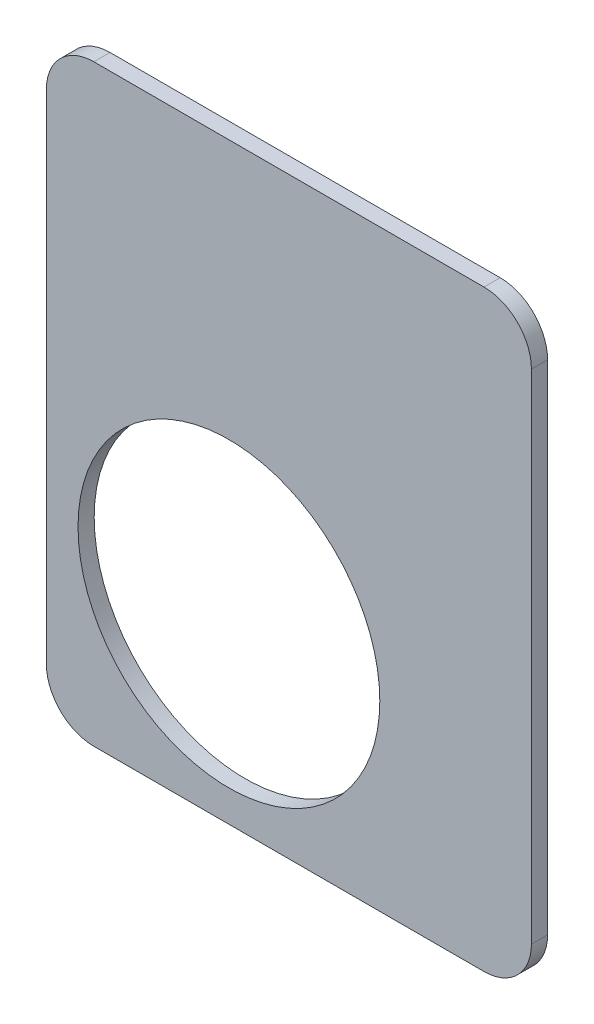
ISO-10303-21;
HEADER;
FILE_DESCRIPTION(('STEP AP214'),'2;1');
FILE_NAME('part.step','',(''),(''),'','','');
FILE_SCHEMA(('AUTOMOTIVE_DESIGN { 1 0 10303 214 1 1 1 1 }'));
ENDSEC;
DATA;
#1=APPLICATION_CONTEXT('core data for automotive mechanical design processes');
#2=APPLICATION_PROTOCOL_DEFINITION('international standard','automotive_design',2000,#1);
#3=PRODUCT_CONTEXT('',#1,'mechanical');
#4=PRODUCT('Part','Part','',(#3));
#5=PRODUCT_RELATED_PRODUCT_CATEGORY('part','',(#4));
#6=PRODUCT_DEFINITION_FORMATION('','',#4);
#7=PRODUCT_DEFINITION_CONTEXT('part definition',#1,'design');
#8=PRODUCT_DEFINITION('design','',#6,#7);
#9=PRODUCT_DEFINITION_SHAPE('','',#8);
#10=(LENGTH_UNIT() NAMED_UNIT(*) SI_UNIT(.MILLI.,.METRE.));
#11=(NAMED_UNIT(*) PLANE_ANGLE_UNIT() SI_UNIT($,.RADIAN.));
#12=(NAMED_UNIT(*) SI_UNIT($,.STERADIAN.) SOLID_ANGLE_UNIT());
#13=UNCERTAINTY_MEASURE_WITH_UNIT(LENGTH_MEASURE(1.E-05),#10,'distance_accuracy_value','');
#14=(GEOMETRIC_REPRESENTATION_CONTEXT(3) GLOBAL_UNCERTAINTY_ASSIGNED_CONTEXT((#13)) GLOBAL_UNIT_ASSIGNED_CONTEXT((#10,
#11,#12)) REPRESENTATION_CONTEXT('',''));
#15=CARTESIAN_POINT('',(0.,0.,0.));
#16=DIRECTION('',(0.,0.,1.));
#17=DIRECTION('',(1.,0.,0.));
#18=AXIS2_PLACEMENT_3D('',#15,#16,#17);
#19=CARTESIAN_POINT('',(293.583334894801,67.8218453448978,15.));
#20=DIRECTION('',(1.,0.,0.));
#21=DIRECTION('',(0.,1.,0.));
#22=AXIS2_PLACEMENT_3D('',#19,#20,#21);
#23=PLANE('',#22);
#24=DIRECTION('',(0.,-1.,0.));
#25=VECTOR('',#24,1.);
#26=CARTESIAN_POINT('',(293.583334894801,67.8218453448978,0.));
#27=LINE('',#26,#25);
#28=CARTESIAN_POINT('',(293.583334894801,67.8218453448978,0.));
#29=VERTEX_POINT('',#28);
#30=CARTESIAN_POINT('',(293.583334894801,-394.178154655102,0.));
#31=VERTEX_POINT('',#30);
#32=EDGE_CURVE('E130',#29,#31,#27,.T.);
#33=ORIENTED_EDGE('',*,*,#32,.F.);
#34=DIRECTION('',(0.,0.,-1.));
#35=VECTOR('',#34,1.);
#36=CARTESIAN_POINT('',(293.583334894801,67.8218453448978,15.));
#37=LINE('',#36,#35);
#38=CARTESIAN_POINT('',(293.583334894801,67.8218453448978,15.));
#39=VERTEX_POINT('',#38);
#40=EDGE_CURVE('E11',#39,#29,#37,.T.);
#41=ORIENTED_EDGE('',*,*,#40,.F.);
#42=DIRECTION('',(0.,-1.,0.));
#43=VECTOR('',#42,1.);
#44=CARTESIAN_POINT('',(293.583334894801,67.8218453448978,15.));
#45=LINE('',#44,#43);
#46=CARTESIAN_POINT('',(293.583334894801,-394.178154655102,15.));
#47=VERTEX_POINT('',#46);
#48=EDGE_CURVE('E150',#39,#47,#45,.T.);
#49=ORIENTED_EDGE('',*,*,#48,.T.);
#50=DIRECTION('',(0.,0.,-1.));
#51=VECTOR('',#50,1.);
#52=CARTESIAN_POINT('',(293.583334894801,-394.178154655102,15.));
#53=LINE('',#52,#51);
#54=EDGE_CURVE('E38',#47,#31,#53,.T.);
#55=ORIENTED_EDGE('',*,*,#54,.T.);
#56=EDGE_LOOP('',(#33,#41,#49,#55));
#57=FACE_BOUND('',#56,.T.);
#58=ADVANCED_FACE('F35',(#57),#23,.T.);
#59=CARTESIAN_POINT('',(249.583334894801,67.8218453448981,15.));
#60=DIRECTION('',(0.,0.,-1.));
#61=DIRECTION('',(-1.,0.,0.));
#62=AXIS2_PLACEMENT_3D('',#59,#60,#61);
#63=CYLINDRICAL_SURFACE('',#62,44.);
#64=CARTESIAN_POINT('',(249.583334894801,67.8218453448981,0.));
#65=DIRECTION('',(0.,0.,1.));
#66=DIRECTION('',(1.,0.,0.));
#67=AXIS2_PLACEMENT_3D('',#64,#65,#66);
#68=CIRCLE('',#67,44.);
#69=CARTESIAN_POINT('',(249.583334894801,111.821845344898,0.));
#70=VERTEX_POINT('',#69);
#71=EDGE_CURVE('E149',#29,#70,#68,.T.);
#72=ORIENTED_EDGE('',*,*,#71,.T.);
#73=DIRECTION('',(0.,0.,-1.));
#74=VECTOR('',#73,1.);
#75=CARTESIAN_POINT('',(249.583334894801,111.821845344898,15.));
#76=LINE('',#75,#74);
#77=CARTESIAN_POINT('',(249.583334894801,111.821845344898,15.));
#78=VERTEX_POINT('',#77);
#79=EDGE_CURVE('E44',#78,#70,#76,.T.);
#80=ORIENTED_EDGE('',*,*,#79,.F.);
#81=CARTESIAN_POINT('',(249.583334894801,67.8218453448981,15.));
#82=DIRECTION('',(0.,0.,1.));
#83=DIRECTION('',(1.,0.,0.));
#84=AXIS2_PLACEMENT_3D('',#81,#82,#83);
#85=CIRCLE('',#84,44.);
#86=EDGE_CURVE('E125',#39,#78,#85,.T.);
#87=ORIENTED_EDGE('',*,*,#86,.F.);
#88=ORIENTED_EDGE('',*,*,#40,.T.);
#89=EDGE_LOOP('',(#72,#80,#87,#88));
#90=FACE_BOUND('',#89,.T.);
#91=ADVANCED_FACE('F163',(#90),#63,.T.);
#92=CARTESIAN_POINT('',(-112.416665105198,111.821845344898,15.));
#93=DIRECTION('',(0.,1.,0.));
#94=DIRECTION('',(0.,0.,1.));
#95=AXIS2_PLACEMENT_3D('',#92,#93,#94);
#96=PLANE('',#95);
#97=DIRECTION('',(1.,0.,0.));
#98=VECTOR('',#97,1.);
#99=CARTESIAN_POINT('',(-112.416665105198,111.821845344898,0.));
#100=LINE('',#99,#98);
#101=CARTESIAN_POINT('',(-112.416665105198,111.821845344898,0.));
#102=VERTEX_POINT('',#101);
#103=EDGE_CURVE('E110',#102,#70,#100,.T.);
#104=ORIENTED_EDGE('',*,*,#103,.F.);
#105=DIRECTION('',(0.,0.,-1.));
#106=VECTOR('',#105,1.);
#107=CARTESIAN_POINT('',(-112.416665105198,111.821845344898,15.));
#108=LINE('',#107,#106);
#109=CARTESIAN_POINT('',(-112.416665105198,111.821845344898,15.));
#110=VERTEX_POINT('',#109);
#111=EDGE_CURVE('E104',#110,#102,#108,.T.);
#112=ORIENTED_EDGE('',*,*,#111,.F.);
#113=DIRECTION('',(1.,0.,0.));
#114=VECTOR('',#113,1.);
#115=CARTESIAN_POINT('',(-112.416665105198,111.821845344898,15.));
#116=LINE('',#115,#114);
#117=EDGE_CURVE('E108',#110,#78,#116,.T.);
#118=ORIENTED_EDGE('',*,*,#117,.T.);
#119=ORIENTED_EDGE('',*,*,#79,.T.);
#120=EDGE_LOOP('',(#104,#112,#118,#119));
#121=FACE_BOUND('',#120,.T.);
#122=ADVANCED_FACE('F106',(#121),#96,.T.);
#123=CARTESIAN_POINT('',(-112.416665105199,67.8218453448981,15.));
#124=DIRECTION('',(0.,0.,-1.));
#125=DIRECTION('',(-1.,0.,0.));
#126=AXIS2_PLACEMENT_3D('',#123,#124,#125);
#127=CYLINDRICAL_SURFACE('',#126,44.);
#128=CARTESIAN_POINT('',(-112.416665105199,67.8218453448981,0.));
#129=DIRECTION('',(0.,0.,1.));
#130=DIRECTION('',(1.,0.,0.));
#131=AXIS2_PLACEMENT_3D('',#128,#129,#130);
#132=CIRCLE('',#131,44.);
#133=CARTESIAN_POINT('',(-156.416665105199,67.8218453448978,0.));
#134=VERTEX_POINT('',#133);
#135=EDGE_CURVE('E146',#102,#134,#132,.T.);
#136=ORIENTED_EDGE('',*,*,#135,.T.);
#137=DIRECTION('',(0.,0.,-1.));
#138=VECTOR('',#137,1.);
#139=CARTESIAN_POINT('',(-156.416665105199,67.8218453448978,15.));
#140=LINE('',#139,#138);
#141=CARTESIAN_POINT('',(-156.416665105199,67.8218453448978,15.));
#142=VERTEX_POINT('',#141);
#143=EDGE_CURVE('E113',#142,#134,#140,.T.);
#144=ORIENTED_EDGE('',*,*,#143,.F.);
#145=CARTESIAN_POINT('',(-112.416665105199,67.8218453448981,15.));
#146=DIRECTION('',(0.,0.,1.));
#147=DIRECTION('',(1.,0.,0.));
#148=AXIS2_PLACEMENT_3D('',#145,#146,#147);
#149=CIRCLE('',#148,44.);
#150=EDGE_CURVE('E116',#110,#142,#149,.T.);
#151=ORIENTED_EDGE('',*,*,#150,.F.);
#152=ORIENTED_EDGE('',*,*,#111,.T.);
#153=EDGE_LOOP('',(#136,#144,#151,#152));
#154=FACE_BOUND('',#153,.T.);
#155=ADVANCED_FACE('F117',(#154),#127,.T.);
#156=CARTESIAN_POINT('',(-156.416665105199,67.8218453448978,15.));
#157=DIRECTION('',(1.,0.,0.));
#158=DIRECTION('',(0.,1.,0.));
#159=AXIS2_PLACEMENT_3D('',#156,#157,#158);
#160=PLANE('',#159);
#161=DIRECTION('',(0.,-1.,0.));
#162=VECTOR('',#161,1.);
#163=CARTESIAN_POINT('',(-156.416665105199,67.8218453448978,0.));
#164=LINE('',#163,#162);
#165=CARTESIAN_POINT('',(-156.416665105199,-394.178154655102,0.));
#166=VERTEX_POINT('',#165);
#167=EDGE_CURVE('E143',#134,#166,#164,.T.);
#168=ORIENTED_EDGE('',*,*,#167,.T.);
#169=DIRECTION('',(0.,0.,-1.));
#170=VECTOR('',#169,1.);
#171=CARTESIAN_POINT('',(-156.416665105199,-394.178154655102,15.));
#172=LINE('',#171,#170);
#173=CARTESIAN_POINT('',(-156.416665105199,-394.178154655102,15.));
#174=VERTEX_POINT('',#173);
#175=EDGE_CURVE('E154',#174,#166,#172,.T.);
#176=ORIENTED_EDGE('',*,*,#175,.F.);
#177=DIRECTION('',(0.,-1.,0.));
#178=VECTOR('',#177,1.);
#179=CARTESIAN_POINT('',(-156.416665105199,67.8218453448978,15.));
#180=LINE('',#179,#178);
#181=EDGE_CURVE('E121',#142,#174,#180,.T.);
#182=ORIENTED_EDGE('',*,*,#181,.F.);
#183=ORIENTED_EDGE('',*,*,#143,.T.);
#184=EDGE_LOOP('',(#168,#176,#182,#183));
#185=FACE_BOUND('',#184,.T.);
#186=ADVANCED_FACE('F178',(#185),#160,.F.);
#187=CARTESIAN_POINT('',(-112.416665105199,-394.178154655102,15.));
#188=DIRECTION('',(0.,0.,-1.));
#189=DIRECTION('',(-1.,0.,0.));
#190=AXIS2_PLACEMENT_3D('',#187,#188,#189);
#191=CYLINDRICAL_SURFACE('',#190,44.);
#192=CARTESIAN_POINT('',(-112.416665105199,-394.178154655102,0.));
#193=DIRECTION('',(0.,0.,-1.));
#194=DIRECTION('',(-1.,0.,0.));
#195=AXIS2_PLACEMENT_3D('',#192,#193,#194);
#196=CIRCLE('',#195,44.);
#197=CARTESIAN_POINT('',(-112.416665105198,-438.178154655102,0.));
#198=VERTEX_POINT('',#197);
#199=EDGE_CURVE('E140',#198,#166,#196,.T.);
#200=ORIENTED_EDGE('',*,*,#199,.F.);
#201=DIRECTION('',(0.,0.,-1.));
#202=VECTOR('',#201,1.);
#203=CARTESIAN_POINT('',(-112.416665105198,-438.178154655102,15.));
#204=LINE('',#203,#202);
#205=CARTESIAN_POINT('',(-112.416665105198,-438.178154655102,15.));
#206=VERTEX_POINT('',#205);
#207=EDGE_CURVE('E156',#206,#198,#204,.T.);
#208=ORIENTED_EDGE('',*,*,#207,.F.);
#209=CARTESIAN_POINT('',(-112.416665105199,-394.178154655102,15.));
#210=DIRECTION('',(0.,0.,-1.));
#211=DIRECTION('',(-1.,0.,0.));
#212=AXIS2_PLACEMENT_3D('',#209,#210,#211);
#213=CIRCLE('',#212,44.);
#214=EDGE_CURVE('E173',#206,#174,#213,.T.);
#215=ORIENTED_EDGE('',*,*,#214,.T.);
#216=ORIENTED_EDGE('',*,*,#175,.T.);
#217=EDGE_LOOP('',(#200,#208,#215,#216));
#218=FACE_BOUND('',#217,.T.);
#219=ADVANCED_FACE('F182',(#218),#191,.T.);
#220=CARTESIAN_POINT('',(-112.416665105198,-438.178154655102,15.));
#221=DIRECTION('',(0.,1.,0.));
#222=DIRECTION('',(0.,0.,1.));
#223=AXIS2_PLACEMENT_3D('',#220,#221,#222);
#224=PLANE('',#223);
#225=DIRECTION('',(1.,0.,0.));
#226=VECTOR('',#225,1.);
#227=CARTESIAN_POINT('',(-112.416665105198,-438.178154655102,0.));
#228=LINE('',#227,#226);
#229=CARTESIAN_POINT('',(249.583334894801,-438.178154655102,0.));
#230=VERTEX_POINT('',#229);
#231=EDGE_CURVE('E137',#198,#230,#228,.T.);
#232=ORIENTED_EDGE('',*,*,#231,.T.);
#233=DIRECTION('',(0.,0.,-1.));
#234=VECTOR('',#233,1.);
#235=CARTESIAN_POINT('',(249.583334894801,-438.178154655102,15.));
#236=LINE('',#235,#234);
#237=CARTESIAN_POINT('',(249.583334894801,-438.178154655102,15.));
#238=VERTEX_POINT('',#237);
#239=EDGE_CURVE('E157',#238,#230,#236,.T.);
#240=ORIENTED_EDGE('',*,*,#239,.F.);
#241=DIRECTION('',(1.,0.,0.));
#242=VECTOR('',#241,1.);
#243=CARTESIAN_POINT('',(-112.416665105198,-438.178154655102,15.));
#244=LINE('',#243,#242);
#245=EDGE_CURVE('E166',#206,#238,#244,.T.);
#246=ORIENTED_EDGE('',*,*,#245,.F.);
#247=ORIENTED_EDGE('',*,*,#207,.T.);
#248=EDGE_LOOP('',(#232,#240,#246,#247));
#249=FACE_BOUND('',#248,.T.);
#250=ADVANCED_FACE('F185',(#249),#224,.F.);
#251=CARTESIAN_POINT('',(249.583334894801,-394.178154655102,15.));
#252=DIRECTION('',(0.,0.,-1.));
#253=DIRECTION('',(-1.,0.,0.));
#254=AXIS2_PLACEMENT_3D('',#251,#252,#253);
#255=CYLINDRICAL_SURFACE('',#254,44.);
#256=CARTESIAN_POINT('',(249.583334894801,-394.178154655102,0.));
#257=DIRECTION('',(0.,0.,-1.));
#258=DIRECTION('',(-1.,0.,0.));
#259=AXIS2_PLACEMENT_3D('',#256,#257,#258);
#260=CIRCLE('',#259,44.);
#261=EDGE_CURVE('E133',#31,#230,#260,.T.);
#262=ORIENTED_EDGE('',*,*,#261,.F.);
#263=ORIENTED_EDGE('',*,*,#54,.F.);
#264=CARTESIAN_POINT('',(249.583334894801,-394.178154655102,15.));
#265=DIRECTION('',(0.,0.,-1.));
#266=DIRECTION('',(-1.,0.,0.));
#267=AXIS2_PLACEMENT_3D('',#264,#265,#266);
#268=CIRCLE('',#267,44.);
#269=EDGE_CURVE('E164',#47,#238,#268,.T.);
#270=ORIENTED_EDGE('',*,*,#269,.T.);
#271=ORIENTED_EDGE('',*,*,#239,.T.);
#272=EDGE_LOOP('',(#262,#263,#270,#271));
#273=FACE_BOUND('',#272,.T.);
#274=ADVANCED_FACE('F159',(#273),#255,.T.);
#275=CARTESIAN_POINT('',(249.583334894801,-394.178154655102,15.));
#276=DIRECTION('',(0.,0.,-1.));
#277=DIRECTION('',(-1.,0.,0.));
#278=AXIS2_PLACEMENT_3D('',#275,#276,#277);
#279=PLANE('',#278);
#280=CARTESIAN_POINT('',(12.9130342867723,-269.021542530009,15.));
#281=DIRECTION('',(0.,0.,1.));
#282=DIRECTION('',(1.,0.,0.));
#283=AXIS2_PLACEMENT_3D('',#280,#281,#282);
#284=CIRCLE('',#283,140.);
#285=CARTESIAN_POINT('',(152.913034286772,-269.021542530009,15.));
#286=VERTEX_POINT('',#285);
#287=EDGE_CURVE('E169',#286,#286,#284,.T.);
#288=ORIENTED_EDGE('',*,*,#287,.F.);
#289=EDGE_LOOP('',(#288));
#290=FACE_BOUND('',#289,.T.);
#291=ORIENTED_EDGE('',*,*,#48,.F.);
#292=ORIENTED_EDGE('',*,*,#86,.T.);
#293=ORIENTED_EDGE('',*,*,#117,.F.);
#294=ORIENTED_EDGE('',*,*,#150,.T.);
#295=ORIENTED_EDGE('',*,*,#181,.T.);
#296=ORIENTED_EDGE('',*,*,#214,.F.);
#297=ORIENTED_EDGE('',*,*,#245,.T.);
#298=ORIENTED_EDGE('',*,*,#269,.F.);
#299=EDGE_LOOP('',(#291,#292,#293,#294,#295,#296,#297,#298));
#300=FACE_BOUND('',#299,.T.);
#301=ADVANCED_FACE('F124',(#290,#300),#279,.F.);
#302=CARTESIAN_POINT('',(249.583334894801,-394.178154655102,0.));
#303=DIRECTION('',(0.,0.,-1.));
#304=DIRECTION('',(-1.,0.,0.));
#305=AXIS2_PLACEMENT_3D('',#302,#303,#304);
#306=PLANE('',#305);
#307=CARTESIAN_POINT('',(12.9130342867723,-269.021542530009,0.));
#308=DIRECTION('',(0.,0.,1.));
#309=DIRECTION('',(1.,0.,0.));
#310=AXIS2_PLACEMENT_3D('',#307,#308,#309);
#311=CIRCLE('',#310,140.);
#312=CARTESIAN_POINT('',(152.913034286772,-269.021542530009,0.));
#313=VERTEX_POINT('',#312);
#314=EDGE_CURVE('E134',#313,#313,#311,.T.);
#315=ORIENTED_EDGE('',*,*,#314,.T.);
#316=EDGE_LOOP('',(#315));
#317=FACE_BOUND('',#316,.T.);
#318=ORIENTED_EDGE('',*,*,#32,.T.);
#319=ORIENTED_EDGE('',*,*,#261,.T.);
#320=ORIENTED_EDGE('',*,*,#231,.F.);
#321=ORIENTED_EDGE('',*,*,#199,.T.);
#322=ORIENTED_EDGE('',*,*,#167,.F.);
#323=ORIENTED_EDGE('',*,*,#135,.F.);
#324=ORIENTED_EDGE('',*,*,#103,.T.);
#325=ORIENTED_EDGE('',*,*,#71,.F.);
#326=EDGE_LOOP('',(#318,#319,#320,#321,#322,#323,#324,#325));
#327=FACE_BOUND('',#326,.T.);
#328=ADVANCED_FACE('F162',(#317,#327),#306,.T.);
#329=CARTESIAN_POINT('',(12.9130342867723,-269.021542530009,0.));
#330=DIRECTION('',(0.,0.,1.));
#331=DIRECTION('',(1.,0.,0.));
#332=AXIS2_PLACEMENT_3D('',#329,#330,#331);
#333=CYLINDRICAL_SURFACE('',#332,140.);
#334=ORIENTED_EDGE('',*,*,#314,.F.);
#335=EDGE_LOOP('',(#334));
#336=FACE_BOUND('',#335,.T.);
#337=ORIENTED_EDGE('',*,*,#287,.T.);
#338=EDGE_LOOP('',(#337));
#339=FACE_BOUND('',#338,.T.);
#340=ADVANCED_FACE('F243',(#336,#339),#333,.F.);
#341=CLOSED_SHELL('',(#58,#91,#122,#155,#186,#219,#250,#274,#301,#328,#340));
#342=MANIFOLD_SOLID_BREP('B2',#341);
#343=ADVANCED_BREP_SHAPE_REPRESENTATION('',(#18,#342),#14);
#344=SHAPE_DEFINITION_REPRESENTATION(#9,#343);
ENDSEC;
END-ISO-10303-21;
